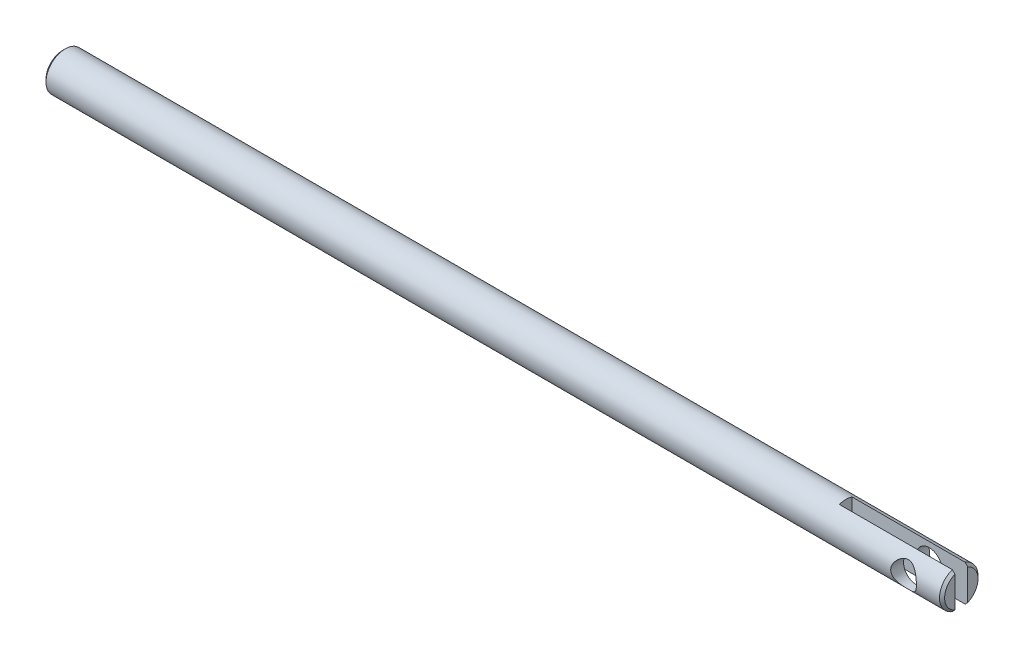
ISO-10303-21;
HEADER;
FILE_DESCRIPTION(('STEP AP214'),'2;1');
FILE_NAME('part.step','',(''),(''),'','','');
FILE_SCHEMA(('AUTOMOTIVE_DESIGN { 1 0 10303 214 1 1 1 1 }'));
ENDSEC;
DATA;
#1=APPLICATION_CONTEXT('core data for automotive mechanical design processes');
#2=APPLICATION_PROTOCOL_DEFINITION('international standard','automotive_design',2000,#1);
#3=PRODUCT_CONTEXT('',#1,'mechanical');
#4=PRODUCT('Part','Part','',(#3));
#5=PRODUCT_RELATED_PRODUCT_CATEGORY('part','',(#4));
#6=PRODUCT_DEFINITION_FORMATION('','',#4);
#7=PRODUCT_DEFINITION_CONTEXT('part definition',#1,'design');
#8=PRODUCT_DEFINITION('design','',#6,#7);
#9=PRODUCT_DEFINITION_SHAPE('','',#8);
#10=(LENGTH_UNIT() NAMED_UNIT(*) SI_UNIT(.MILLI.,.METRE.));
#11=(NAMED_UNIT(*) PLANE_ANGLE_UNIT() SI_UNIT($,.RADIAN.));
#12=(NAMED_UNIT(*) SI_UNIT($,.STERADIAN.) SOLID_ANGLE_UNIT());
#13=UNCERTAINTY_MEASURE_WITH_UNIT(LENGTH_MEASURE(1.E-05),#10,'distance_accuracy_value','');
#14=(GEOMETRIC_REPRESENTATION_CONTEXT(3) GLOBAL_UNCERTAINTY_ASSIGNED_CONTEXT((#13)) GLOBAL_UNIT_ASSIGNED_CONTEXT((#10,
#11,#12)) REPRESENTATION_CONTEXT('',''));
#15=CARTESIAN_POINT('',(0.,0.,0.));
#16=DIRECTION('',(0.,0.,1.));
#17=DIRECTION('',(1.,0.,0.));
#18=AXIS2_PLACEMENT_3D('',#15,#16,#17);
#19=CARTESIAN_POINT('',(0.,1.49999999999999,0.));
#20=DIRECTION('',(1.,0.,0.));
#21=DIRECTION('',(0.,1.,0.));
#22=AXIS2_PLACEMENT_3D('',#19,#20,#21);
#23=PLANE('',#22);
#24=DIRECTION('',(0.,1.,0.));
#25=VECTOR('',#24,1.);
#26=CARTESIAN_POINT('',(0.,-1.5,0.5));
#27=LINE('',#26,#25);
#28=CARTESIAN_POINT('',(0.,-1.20000000000001,0.5));
#29=VERTEX_POINT('',#28);
#30=CARTESIAN_POINT('',(0.,1.20000000000001,0.5));
#31=VERTEX_POINT('',#30);
#32=EDGE_CURVE('E121',#29,#31,#27,.T.);
#33=ORIENTED_EDGE('',*,*,#32,.T.);
#34=CARTESIAN_POINT('',(0.,0.,0.));
#35=DIRECTION('',(1.,0.,0.));
#36=DIRECTION('',(0.,1.,0.));
#37=AXIS2_PLACEMENT_3D('',#34,#35,#36);
#38=CIRCLE('',#37,1.30000000000001);
#39=EDGE_CURVE('E173',#31,#29,#38,.T.);
#40=ORIENTED_EDGE('',*,*,#39,.T.);
#41=EDGE_LOOP('',(#33,#40));
#42=FACE_BOUND('',#41,.T.);
#43=ADVANCED_FACE('F40',(#42),#23,.T.);
#44=CARTESIAN_POINT('',(-3.,0.,-1.5));
#45=DIRECTION('',(0.,0.,1.));
#46=DIRECTION('',(1.,0.,0.));
#47=AXIS2_PLACEMENT_3D('',#44,#45,#46);
#48=CYLINDRICAL_SURFACE('',#47,1.);
#49=CARTESIAN_POINT('',(-3.,0.,0.5));
#50=DIRECTION('',(0.,0.,1.));
#51=DIRECTION('',(1.,0.,0.));
#52=AXIS2_PLACEMENT_3D('',#49,#50,#51);
#53=CIRCLE('',#52,1.);
#54=CARTESIAN_POINT('',(-2.,0.,0.5));
#55=VERTEX_POINT('',#54);
#56=EDGE_CURVE('E127',#55,#55,#53,.F.);
#57=ORIENTED_EDGE('',*,*,#56,.T.);
#58=EDGE_LOOP('',(#57));
#59=FACE_BOUND('',#58,.T.);
#60=CARTESIAN_POINT('',(-2.,0.,1.5));
#61=CARTESIAN_POINT('',(-1.99999972518375,0.0502423583340636,1.50000020822414));
#62=CARTESIAN_POINT('',(-2.00380698497775,0.100484543566457,1.49745401376692));
#63=CARTESIAN_POINT('',(-2.01879843205283,0.199366529015833,1.48752326211905));
#64=CARTESIAN_POINT('',(-2.02998612156165,0.248005556977501,1.48013640790617));
#65=CARTESIAN_POINT('',(-2.05905385866242,0.342106153927126,1.46125241202353));
#66=CARTESIAN_POINT('',(-2.07690257000397,0.387581436328777,1.44977452746657));
#67=CARTESIAN_POINT('',(-2.11853168163575,0.474707645498629,1.4236306893872));
#68=CARTESIAN_POINT('',(-2.14231294315028,0.516358015804833,1.40896427302754));
#69=CARTESIAN_POINT('',(-2.19732846868371,0.598642350385054,1.37613664684919));
#70=CARTESIAN_POINT('',(-2.22902393037145,0.638890152730337,1.35778448789659));
#71=CARTESIAN_POINT('',(-2.29786502432922,0.713864022346368,1.31991156541732));
#72=CARTESIAN_POINT('',(-2.33501846491887,0.748582027719438,1.30038915178415));
#73=CARTESIAN_POINT('',(-2.42052618380633,0.81711148872748,1.25864132339397));
#74=CARTESIAN_POINT('',(-2.46972282660172,0.849915931813754,1.23647533968899));
#75=CARTESIAN_POINT('',(-2.57418168882327,0.906751785070867,1.19542073676408));
#76=CARTESIAN_POINT('',(-2.62943320078139,0.930798367132494,1.17652647977326));
#77=CARTESIAN_POINT('',(-2.7283556467108,0.963370175057203,1.14988133320735));
#78=CARTESIAN_POINT('',(-2.77076422643691,0.974372236180082,1.14048813946217));
#79=CARTESIAN_POINT('',(-2.85737225237086,0.9907530889261,1.12628984829785));
#80=CARTESIAN_POINT('',(-2.90156847436319,0.996141573259661,1.12147684372013));
#81=CARTESIAN_POINT('',(-2.99073738942807,1.00095682070629,1.11718302804083));
#82=CARTESIAN_POINT('',(-3.0357125117256,1.0003592145882,1.11772401279478));
#83=CARTESIAN_POINT('',(-3.12481748675048,0.993187906666195,1.12409887741485));
#84=CARTESIAN_POINT('',(-3.16894659101631,0.986609141899785,1.12993724142591));
#85=CARTESIAN_POINT('',(-3.25323352561879,0.968324971088713,1.1456359299579));
#86=CARTESIAN_POINT('',(-3.29348066796152,0.956858557405004,1.15530744165152));
#87=CARTESIAN_POINT('',(-3.37151184549575,0.929350592909502,1.17754811463844));
#88=CARTESIAN_POINT('',(-3.40929506514863,0.913307536614356,1.19011822916388));
#89=CARTESIAN_POINT('',(-3.48951269764114,0.87336909369832,1.21982098202211));
#90=CARTESIAN_POINT('',(-3.53132995009406,0.848540261643844,1.23736158924506));
#91=CARTESIAN_POINT('',(-3.6106916974919,0.793344802336531,1.27345768922483));
#92=CARTESIAN_POINT('',(-3.64823082883713,0.76297134504034,1.29201441370946));
#93=CARTESIAN_POINT('',(-3.72627127285556,0.689905826559713,1.33271671862095));
#94=CARTESIAN_POINT('',(-3.7656670243557,0.645969691404502,1.35477372355024));
#95=CARTESIAN_POINT('',(-3.83659824725493,0.551003999553813,1.39609050337856));
#96=CARTESIAN_POINT('',(-3.86814107270104,0.499981149675167,1.41535288825284));
#97=CARTESIAN_POINT('',(-3.9167388593142,0.402428913545604,1.44572702044165));
#98=CARTESIAN_POINT('',(-3.93542168167021,0.356978821685245,1.45769630582497));
#99=CARTESIAN_POINT('',(-3.96605246281194,0.263018021968458,1.47753859515521));
#100=CARTESIAN_POINT('',(-3.97800611356591,0.214509939501022,1.48541506063844));
#101=CARTESIAN_POINT('',(-3.9945805826192,0.115492726585951,1.49637941078331));
#102=CARTESIAN_POINT('',(-3.99916973046918,0.0649759059670271,1.49944661230575));
#103=CARTESIAN_POINT('',(-4.00062354428105,-0.0362207596946135,1.50041557482591));
#104=CARTESIAN_POINT('',(-3.99748875024439,-0.0869005930932786,1.49831769692815));
#105=CARTESIAN_POINT('',(-3.98418797221902,-0.183227858602144,1.48949794712138));
#106=CARTESIAN_POINT('',(-3.97453135112234,-0.228978722339653,1.48311123195135));
#107=CARTESIAN_POINT('',(-3.94920215699362,-0.318058196213637,1.46659224642396));
#108=CARTESIAN_POINT('',(-3.9335286245361,-0.361386418785352,1.45645937873408));
#109=CARTESIAN_POINT('',(-3.89567385147733,-0.447332375233218,1.4324817626467));
#110=CARTESIAN_POINT('',(-3.87315592295824,-0.489748092316561,1.41844935068245));
#111=CARTESIAN_POINT('',(-3.8227833550277,-0.570341511977787,1.38800927805402));
#112=CARTESIAN_POINT('',(-3.79492541973704,-0.608516574097252,1.37160015200651));
#113=CARTESIAN_POINT('',(-3.72969606591763,-0.68592722741532,1.33477273328242));
#114=CARTESIAN_POINT('',(-3.69151686994798,-0.724375937862662,1.31413078406202));
#115=CARTESIAN_POINT('',(-3.60944428503593,-0.79466984033239,1.27285586536854));
#116=CARTESIAN_POINT('',(-3.56554698050061,-0.826510468230431,1.25222291185946));
#117=CARTESIAN_POINT('',(-3.4764287935708,-0.880623882794762,1.21469839506517));
#118=CARTESIAN_POINT('',(-3.43163398310015,-0.903478180804392,1.19763798588661));
#119=CARTESIAN_POINT('',(-3.33806367360943,-0.94248106887625,1.16719487207112));
#120=CARTESIAN_POINT('',(-3.28929553080231,-0.958641728453858,1.1538055628277));
#121=CARTESIAN_POINT('',(-3.19771775643296,-0.981179217293118,1.13466604076532));
#122=CARTESIAN_POINT('',(-3.15541409507053,-0.988792987823091,1.12797499006894));
#123=CARTESIAN_POINT('',(-3.06971335933229,-0.998496029624887,1.11939733222928));
#124=CARTESIAN_POINT('',(-3.02631752442677,-1.00059130142516,1.11750550674065));
#125=CARTESIAN_POINT('',(-2.93967847164164,-0.999119609907757,1.11882100574832));
#126=CARTESIAN_POINT('',(-2.89643535931855,-0.995549293852657,1.12203134956833));
#127=CARTESIAN_POINT('',(-2.81132823572852,-0.982984986109972,1.13305226198639));
#128=CARTESIAN_POINT('',(-2.76946614306962,-0.973983758587651,1.14086896751216));
#129=CARTESIAN_POINT('',(-2.67714440678569,-0.94796517835631,1.16263421968269));
#130=CARTESIAN_POINT('',(-2.62736614363047,-0.929450935941996,1.17766166854602));
#131=CARTESIAN_POINT('',(-2.53225658291059,-0.885422631474877,1.2111108062916));
#132=CARTESIAN_POINT('',(-2.48693165103158,-0.859898741785424,1.22953724861882));
#133=CARTESIAN_POINT('',(-2.40035905640317,-0.801991402694661,1.26808593269725));
#134=CARTESIAN_POINT('',(-2.35920062728075,-0.769491549448276,1.2882329369107));
#135=CARTESIAN_POINT('',(-2.28233876087877,-0.698358840177314,1.32814150773992));
#136=CARTESIAN_POINT('',(-2.2466370014876,-0.659724105134957,1.34790295417639));
#137=CARTESIAN_POINT('',(-2.17664394784295,-0.570728664877774,1.38815775980392));
#138=CARTESIAN_POINT('',(-2.14329067991018,-0.519480834775993,1.40834902724557));
#139=CARTESIAN_POINT('',(-2.08604336166802,-0.410434277887496,1.44388832937517));
#140=CARTESIAN_POINT('',(-2.06213444658818,-0.352646031225029,1.4592439672273));
#141=CARTESIAN_POINT('',(-2.02942271091799,-0.24571753491753,1.48050822418367));
#142=CARTESIAN_POINT('',(-2.01844448045066,-0.197506162628871,1.48775740184445));
#143=CARTESIAN_POINT('',(-2.00373598373098,-0.0995290060120671,1.49750140070948));
#144=CARTESIAN_POINT('',(-2.000000272202,-0.0497644180940297,1.49999979375663));
#145=CARTESIAN_POINT('',(-2.,0.,1.5));
#146=B_SPLINE_CURVE_WITH_KNOTS('',3,(#60,#61,#62,#63,#64,#65,#66,#67,#68,#69,#70,#71,#72,#73,
#74,#75,#76,#77,#78,#79,#80,#81,#82,#83,#84,#85,#86,#87,#88,#89,#90,#91,#92,#93,#94,#95,#96,#97,
#98,#99,#100,#101,#102,#103,#104,#105,#106,#107,#108,#109,#110,#111,#112,#113,#114,#115,#116,
#117,#118,#119,#120,#121,#122,#123,#124,#125,#126,#127,#128,#129,#130,#131,#132,#133,#134,#135,
#136,#137,#138,#139,#140,#141,#142,#143,#144,#145),.UNSPECIFIED.,.T.,.F.,(4,2,2,2,2,2,2,2,2,2,2,
2,2,2,2,2,2,2,2,2,2,2,2,2,2,2,2,2,2,2,2,2,2,2,2,2,2,2,2,2,2,2,4),(0.,0.150526613252699,
0.301124707174344,0.451023076595116,0.600943219336932,0.763585145002783,0.926462058021592,
1.11503341647991,1.30327652722719,1.43716846838015,1.57082883922904,1.70503355867689,
1.83935198631676,1.96774431099011,2.09617891902539,2.25073787329797,2.40548851889212,
2.5935947724756,2.78152420149865,2.93262043847563,3.0835886757059,3.23520441646309,
3.38680955765891,3.5277654239542,3.66874377568319,3.81826173413942,3.96787227471786,
4.14114088069829,4.31452876587063,4.473249676497,4.63168313315306,4.76162024003012,
4.8914160016149,5.02128860137217,5.15133461921144,5.31603304346011,5.48096356682587,
5.64889622595852,5.81688041978686,6.00897675773024,6.20076953274023,6.34997645676983,
6.49907115623394),.UNSPECIFIED.);
#147=CARTESIAN_POINT('',(-2.,0.,1.5));
#148=VERTEX_POINT('',#147);
#149=EDGE_CURVE('E130',#148,#148,#146,.T.);
#150=ORIENTED_EDGE('',*,*,#149,.T.);
#151=EDGE_LOOP('',(#150));
#152=FACE_BOUND('',#151,.T.);
#153=ADVANCED_FACE('F153',(#59,#152),#48,.F.);
#154=CARTESIAN_POINT('',(0.,0.,0.));
#155=DIRECTION('',(-1.,0.,0.));
#156=DIRECTION('',(0.,-1.,0.));
#157=AXIS2_PLACEMENT_3D('',#154,#155,#156);
#158=CONICAL_SURFACE('',#157,1.30000000000001,0.785398163397436);
#159=CARTESIAN_POINT('',(-0.200699999999992,1.41495600284955,0.5));
#160=CARTESIAN_POINT('',(-0.158123110444248,1.36978572423713,0.5));
#161=CARTESIAN_POINT('',(-0.115652741441511,1.32451353423616,0.5));
#162=CARTESIAN_POINT('',(-0.0309990029629957,1.23362950858963,0.5));
#163=CARTESIAN_POINT('',(0.0111840899659806,1.18801741555807,0.5));
#164=CARTESIAN_POINT('',(0.0964180633701382,1.09497344390221,0.5));
#165=CARTESIAN_POINT('',(0.139455265209751,1.04752900944401,0.5));
#166=CARTESIAN_POINT('',(0.224829182826531,0.952076958611879,0.5));
#167=CARTESIAN_POINT('',(0.267166413387566,0.904069804947357,0.5));
#168=CARTESIAN_POINT('',(0.350788446158843,0.807217119690665,0.5));
#169=CARTESIAN_POINT('',(0.39207411636959,0.758372339183208,0.5));
#170=CARTESIAN_POINT('',(0.473121637652178,0.659212174030844,0.5));
#171=CARTESIAN_POINT('',(0.51287957162681,0.608893525411639,0.5));
#172=CARTESIAN_POINT('',(0.570041865454716,0.53208994223167,0.5));
#173=CARTESIAN_POINT('',(0.588567685501148,0.506443658555305,0.5));
#174=CARTESIAN_POINT('',(0.624597632105828,0.454446780401328,0.5));
#175=CARTESIAN_POINT('',(0.642102045195436,0.428096386498572,0.5));
#176=CARTESIAN_POINT('',(0.675596596373045,0.374584607448489,0.5));
#177=CARTESIAN_POINT('',(0.691592383711208,0.34742679320373,0.5));
#178=CARTESIAN_POINT('',(0.721461599560177,0.291979843702112,0.5));
#179=CARTESIAN_POINT('',(0.735337797967258,0.263692246942248,0.5));
#180=CARTESIAN_POINT('',(0.754017116892704,0.21972776982632,0.5));
#181=CARTESIAN_POINT('',(0.759970281671413,0.204542386023077,0.5));
#182=CARTESIAN_POINT('',(0.770848947591589,0.173806026937903,0.5));
#183=CARTESIAN_POINT('',(0.775774230535324,0.158254974810241,0.5));
#184=CARTESIAN_POINT('',(0.788647810542469,0.111260819823713,0.5));
#185=CARTESIAN_POINT('',(0.794784151859932,0.0792763405576124,0.5));
#186=CARTESIAN_POINT('',(0.800843689051247,0.0143366110026087,0.5));
#187=CARTESIAN_POINT('',(0.800698239741102,-0.0186254288947944,0.5));
#188=CARTESIAN_POINT('',(0.794049633860656,-0.0839997461898909,0.5));
#189=CARTESIAN_POINT('',(0.787519576103568,-0.116409106912415,0.5));
#190=CARTESIAN_POINT('',(0.772100004311058,-0.170752308813592,0.5));
#191=CARTESIAN_POINT('',(0.76440470224953,-0.193050532954734,0.5));
#192=CARTESIAN_POINT('',(0.747086097461046,-0.236893973733534,0.5));
#193=CARTESIAN_POINT('',(0.737461546751829,-0.258438692297225,0.5));
#194=CARTESIAN_POINT('',(0.716667534286072,-0.301043410258873,0.5));
#195=CARTESIAN_POINT('',(0.705482581289545,-0.322095712222197,0.5));
#196=CARTESIAN_POINT('',(0.68202578452451,-0.363568907889214,0.5));
#197=CARTESIAN_POINT('',(0.669754350644946,-0.383990035821956,0.5));
#198=CARTESIAN_POINT('',(0.625939416567962,-0.45372064664585,0.5));
#199=CARTESIAN_POINT('',(0.592376475234068,-0.501751741103939,0.5));
#200=CARTESIAN_POINT('',(0.522714416232876,-0.595952689699732,0.5));
#201=CARTESIAN_POINT('',(0.486612469325218,-0.642120374326524,0.5));
#202=CARTESIAN_POINT('',(0.412766609998626,-0.733420070379991,0.5));
#203=CARTESIAN_POINT('',(0.375016813769713,-0.778547310415562,0.5));
#204=CARTESIAN_POINT('',(0.298589013270444,-0.867962487114289,0.5));
#205=CARTESIAN_POINT('',(0.25991148253913,-0.912250832145326,0.5));
#206=CARTESIAN_POINT('',(0.186347368146678,-0.995262395554173,0.5));
#207=CARTESIAN_POINT('',(0.151529169252361,-1.03404635906982,0.5));
#208=CARTESIAN_POINT('',(0.0815205080203143,-1.11128667576953,0.5));
#209=CARTESIAN_POINT('',(0.0463299912223991,-1.14974297949795,0.5));
#210=CARTESIAN_POINT('',(-0.0240529289648294,-1.22610540518904,0.5));
#211=CARTESIAN_POINT('',(-0.059243214457122,-1.26401348213408,0.5));
#212=CARTESIAN_POINT('',(-0.12982993305977,-1.33962417017204,0.5));
#213=CARTESIAN_POINT('',(-0.165226326752405,-1.37732681804515,0.5));
#214=CARTESIAN_POINT('',(-0.200699999999992,-1.41495600284955,0.5));
#215=B_SPLINE_CURVE_WITH_KNOTS('',3,(#159,#160,#161,#162,#163,#164,#165,#166,#167,#168,#169,
#170,#171,#172,#173,#174,#175,#176,#177,#178,#179,#180,#181,#182,#183,#184,#185,#186,#187,#188,
#189,#190,#191,#192,#193,#194,#195,#196,#197,#198,#199,#200,#201,#202,#203,#204,#205,#206,#207,
#208,#209,#210,#211,#212,#213,#214),.UNSPECIFIED.,.F.,.F.,(4,2,2,2,2,2,2,2,2,2,2,2,2,2,2,2,2,2,
2,2,2,2,2,2,2,2,2,4),(0.,0.18622264320256,0.372604566470571,0.564768816519382,0.756784819383444,
0.948636820223556,1.14095173020882,1.23584803017517,1.33071757998479,1.42521646231084,
1.51959077630242,1.56848971671423,1.61739902680959,1.71456439320266,1.81279181420175,
1.91143490234827,1.98210501649497,2.05282099374399,2.12429693960838,2.19574603422311,
2.37133786476196,2.54712855783251,2.72360861718805,2.90000043695765,3.05635752258121,
3.21273780428534,3.36790910078899,3.52305163678165),.UNSPECIFIED.);
#216=CARTESIAN_POINT('',(-0.199999999999992,1.41421356237309,0.5));
#217=VERTEX_POINT('',#216);
#218=EDGE_CURVE('E178',#217,#31,#215,.T.);
#219=ORIENTED_EDGE('',*,*,#218,.F.);
#220=CARTESIAN_POINT('',(-0.199999999999992,0.,0.));
#221=DIRECTION('',(1.,0.,0.));
#222=DIRECTION('',(0.,1.,0.));
#223=AXIS2_PLACEMENT_3D('',#220,#221,#222);
#224=CIRCLE('',#223,1.5);
#225=CARTESIAN_POINT('',(-0.199999999999992,-1.41421356237309,0.5));
#226=VERTEX_POINT('',#225);
#227=EDGE_CURVE('E319',#226,#217,#224,.F.);
#228=ORIENTED_EDGE('',*,*,#227,.F.);
#229=EDGE_CURVE('E180',#29,#226,#215,.T.);
#230=ORIENTED_EDGE('',*,*,#229,.F.);
#231=ORIENTED_EDGE('',*,*,#39,.F.);
#232=EDGE_LOOP('',(#219,#228,#230,#231));
#233=FACE_BOUND('',#232,.T.);
#234=ADVANCED_FACE('F168',(#233),#158,.T.);
#235=CARTESIAN_POINT('',(-70.,0.,0.));
#236=DIRECTION('',(-1.,0.,0.));
#237=DIRECTION('',(0.,-1.,0.));
#238=AXIS2_PLACEMENT_3D('',#235,#236,#237);
#239=PLANE('',#238);
#240=CARTESIAN_POINT('',(-70.,0.,0.));
#241=DIRECTION('',(-1.,0.,0.));
#242=DIRECTION('',(0.,-1.,0.));
#243=AXIS2_PLACEMENT_3D('',#240,#241,#242);
#244=CIRCLE('',#243,1.29999999999997);
#245=CARTESIAN_POINT('',(-70.,-1.29999999999998,0.));
#246=VERTEX_POINT('',#245);
#247=EDGE_CURVE('E187',#246,#246,#244,.T.);
#248=ORIENTED_EDGE('',*,*,#247,.T.);
#249=EDGE_LOOP('',(#248));
#250=FACE_BOUND('',#249,.T.);
#251=ADVANCED_FACE('F162',(#250),#239,.T.);
#252=CARTESIAN_POINT('',(0.,0.,0.));
#253=DIRECTION('',(1.,0.,0.));
#254=DIRECTION('',(0.,1.,0.));
#255=AXIS2_PLACEMENT_3D('',#252,#253,#254);
#256=CYLINDRICAL_SURFACE('',#255,1.5);
#257=DIRECTION('',(1.,0.,0.));
#258=VECTOR('',#257,1.);
#259=CARTESIAN_POINT('',(0.,-1.41421356237309,0.5));
#260=LINE('',#259,#258);
#261=CARTESIAN_POINT('',(-9.,-1.41421356237309,0.499999999999999));
#262=VERTEX_POINT('',#261);
#263=EDGE_CURVE('E119',#226,#262,#260,.F.);
#264=ORIENTED_EDGE('',*,*,#263,.F.);
#265=ORIENTED_EDGE('',*,*,#227,.T.);
#266=DIRECTION('',(1.,0.,0.));
#267=VECTOR('',#266,1.);
#268=CARTESIAN_POINT('',(0.,1.41421356237309,0.5));
#269=LINE('',#268,#267);
#270=CARTESIAN_POINT('',(-9.,1.41421356237309,0.499999999999999));
#271=VERTEX_POINT('',#270);
#272=EDGE_CURVE('E65',#271,#217,#269,.T.);
#273=ORIENTED_EDGE('',*,*,#272,.F.);
#274=CARTESIAN_POINT('',(-9.,0.,0.));
#275=DIRECTION('',(-1.,0.,0.));
#276=DIRECTION('',(0.,0.,1.));
#277=AXIS2_PLACEMENT_3D('',#274,#275,#276);
#278=CIRCLE('',#277,1.5);
#279=CARTESIAN_POINT('',(-9.,1.41421356237309,-0.499999999999999));
#280=VERTEX_POINT('',#279);
#281=EDGE_CURVE('E46',#280,#271,#278,.F.);
#282=ORIENTED_EDGE('',*,*,#281,.F.);
#283=DIRECTION('',(1.,0.,0.));
#284=VECTOR('',#283,1.);
#285=CARTESIAN_POINT('',(0.,1.41421356237309,-0.5));
#286=LINE('',#285,#284);
#287=CARTESIAN_POINT('',(-0.199999999999992,1.41421356237309,-0.5));
#288=VERTEX_POINT('',#287);
#289=EDGE_CURVE('E109',#288,#280,#286,.F.);
#290=ORIENTED_EDGE('',*,*,#289,.F.);
#291=CARTESIAN_POINT('',(-0.199999999999992,-1.41421356237309,-0.5));
#292=VERTEX_POINT('',#291);
#293=EDGE_CURVE('E115',#288,#292,#224,.F.);
#294=ORIENTED_EDGE('',*,*,#293,.T.);
#295=DIRECTION('',(1.,0.,0.));
#296=VECTOR('',#295,1.);
#297=CARTESIAN_POINT('',(0.,-1.41421356237309,-0.5));
#298=LINE('',#297,#296);
#299=CARTESIAN_POINT('',(-9.,-1.41421356237309,-0.499999999999999));
#300=VERTEX_POINT('',#299);
#301=EDGE_CURVE('E106',#300,#292,#298,.T.);
#302=ORIENTED_EDGE('',*,*,#301,.F.);
#303=EDGE_CURVE('E12',#262,#300,#278,.F.);
#304=ORIENTED_EDGE('',*,*,#303,.F.);
#305=EDGE_LOOP('',(#264,#265,#273,#282,#290,#294,#302,#304));
#306=FACE_BOUND('',#305,.T.);
#307=CARTESIAN_POINT('',(-69.8,0.,0.));
#308=DIRECTION('',(-1.,0.,0.));
#309=DIRECTION('',(0.,-1.,0.));
#310=AXIS2_PLACEMENT_3D('',#307,#308,#309);
#311=CIRCLE('',#310,1.5);
#312=CARTESIAN_POINT('',(-69.8,-1.5,0.));
#313=VERTEX_POINT('',#312);
#314=EDGE_CURVE('E316',#313,#313,#311,.F.);
#315=ORIENTED_EDGE('',*,*,#314,.T.);
#316=EDGE_LOOP('',(#315));
#317=FACE_BOUND('',#316,.T.);
#318=CARTESIAN_POINT('',(-2.,0.,-1.5));
#319=CARTESIAN_POINT('',(-1.99999972518375,-0.050242358334064,-1.50000020822414));
#320=CARTESIAN_POINT('',(-2.00380698497775,-0.100484543566457,-1.49745401376692));
#321=CARTESIAN_POINT('',(-2.01879843205283,-0.199366529015834,-1.48752326211905));
#322=CARTESIAN_POINT('',(-2.02998612156165,-0.248005556977501,-1.48013640790617));
#323=CARTESIAN_POINT('',(-2.05905385866242,-0.342106153927126,-1.46125241202353));
#324=CARTESIAN_POINT('',(-2.07690257000397,-0.387581436328778,-1.44977452746657));
#325=CARTESIAN_POINT('',(-2.11853168163575,-0.474707645498629,-1.4236306893872));
#326=CARTESIAN_POINT('',(-2.14231294315028,-0.516358015804834,-1.40896427302754));
#327=CARTESIAN_POINT('',(-2.19732846868371,-0.598642350385054,-1.37613664684919));
#328=CARTESIAN_POINT('',(-2.22902393037145,-0.638890152730338,-1.35778448789659));
#329=CARTESIAN_POINT('',(-2.29786502432922,-0.713864022346369,-1.31991156541732));
#330=CARTESIAN_POINT('',(-2.33501846491887,-0.748582027719439,-1.30038915178415));
#331=CARTESIAN_POINT('',(-2.42052618380634,-0.81711148872748,-1.25864132339397));
#332=CARTESIAN_POINT('',(-2.46972282660172,-0.849915931813755,-1.23647533968899));
#333=CARTESIAN_POINT('',(-2.57418168882327,-0.906751785070868,-1.19542073676408));
#334=CARTESIAN_POINT('',(-2.62943320078139,-0.930798367132494,-1.17652647977326));
#335=CARTESIAN_POINT('',(-2.7283556467108,-0.963370175057203,-1.14988133320735));
#336=CARTESIAN_POINT('',(-2.77076422643691,-0.974372236180082,-1.14048813946217));
#337=CARTESIAN_POINT('',(-2.85737225237087,-0.9907530889261,-1.12628984829785));
#338=CARTESIAN_POINT('',(-2.90156847436319,-0.996141573259661,-1.12147684372013));
#339=CARTESIAN_POINT('',(-2.99073738942807,-1.00095682070629,-1.11718302804083));
#340=CARTESIAN_POINT('',(-3.0357125117256,-1.0003592145882,-1.11772401279478));
#341=CARTESIAN_POINT('',(-3.12481748675048,-0.993187906666195,-1.12409887741485));
#342=CARTESIAN_POINT('',(-3.16894659101631,-0.986609141899784,-1.12993724142591));
#343=CARTESIAN_POINT('',(-3.25323352561879,-0.968324971088713,-1.1456359299579));
#344=CARTESIAN_POINT('',(-3.29348066796152,-0.956858557405004,-1.15530744165152));
#345=CARTESIAN_POINT('',(-3.37151184549575,-0.929350592909502,-1.17754811463844));
#346=CARTESIAN_POINT('',(-3.40929506514863,-0.913307536614356,-1.19011822916388));
#347=CARTESIAN_POINT('',(-3.48951269764114,-0.87336909369832,-1.21982098202211));
#348=CARTESIAN_POINT('',(-3.53132995009406,-0.848540261643844,-1.23736158924506));
#349=CARTESIAN_POINT('',(-3.6106916974919,-0.793344802336531,-1.27345768922483));
#350=CARTESIAN_POINT('',(-3.64823082883713,-0.76297134504034,-1.29201441370946));
#351=CARTESIAN_POINT('',(-3.72627127285556,-0.689905826559713,-1.33271671862095));
#352=CARTESIAN_POINT('',(-3.7656670243557,-0.645969691404501,-1.35477372355024));
#353=CARTESIAN_POINT('',(-3.83659824725493,-0.551003999553812,-1.39609050337856));
#354=CARTESIAN_POINT('',(-3.86814107270104,-0.499981149675166,-1.41535288825284));
#355=CARTESIAN_POINT('',(-3.9167388593142,-0.402428913545603,-1.44572702044165));
#356=CARTESIAN_POINT('',(-3.93542168167021,-0.356978821685244,-1.45769630582497));
#357=CARTESIAN_POINT('',(-3.96605246281194,-0.263018021968457,-1.47753859515521));
#358=CARTESIAN_POINT('',(-3.97800611356591,-0.214509939501021,-1.48541506063844));
#359=CARTESIAN_POINT('',(-3.9945805826192,-0.11549272658595,-1.49637941078331));
#360=CARTESIAN_POINT('',(-3.99916973046918,-0.0649759059670257,-1.49944661230575));
#361=CARTESIAN_POINT('',(-4.00062354428105,0.036220759694615,-1.50041557482591));
#362=CARTESIAN_POINT('',(-3.99748875024439,0.0869005930932802,-1.49831769692815));
#363=CARTESIAN_POINT('',(-3.98418797221902,0.183227858602145,-1.48949794712138));
#364=CARTESIAN_POINT('',(-3.97453135112234,0.228978722339654,-1.48311123195135));
#365=CARTESIAN_POINT('',(-3.94920215699362,0.318058196213639,-1.46659224642396));
#366=CARTESIAN_POINT('',(-3.9335286245361,0.361386418785354,-1.45645937873408));
#367=CARTESIAN_POINT('',(-3.89567385147732,0.44733237523322,-1.4324817626467));
#368=CARTESIAN_POINT('',(-3.87315592295824,0.489748092316562,-1.41844935068245));
#369=CARTESIAN_POINT('',(-3.8227833550277,0.570341511977789,-1.38800927805402));
#370=CARTESIAN_POINT('',(-3.79492541973704,0.608516574097253,-1.37160015200651));
#371=CARTESIAN_POINT('',(-3.72969606591763,0.685927227415322,-1.33477273328242));
#372=CARTESIAN_POINT('',(-3.69151686994798,0.724375937862664,-1.31413078406202));
#373=CARTESIAN_POINT('',(-3.60944428503593,0.794669840332391,-1.27285586536854));
#374=CARTESIAN_POINT('',(-3.5655469805006,0.826510468230432,-1.25222291185946));
#375=CARTESIAN_POINT('',(-3.4764287935708,0.880623882794763,-1.21469839506517));
#376=CARTESIAN_POINT('',(-3.43163398310015,0.903478180804393,-1.19763798588661));
#377=CARTESIAN_POINT('',(-3.33806367360943,0.94248106887625,-1.16719487207112));
#378=CARTESIAN_POINT('',(-3.28929553080231,0.958641728453858,-1.15380556282769));
#379=CARTESIAN_POINT('',(-3.19771775643296,0.981179217293119,-1.13466604076532));
#380=CARTESIAN_POINT('',(-3.15541409507053,0.988792987823092,-1.12797499006894));
#381=CARTESIAN_POINT('',(-3.06971335933229,0.998496029624887,-1.11939733222928));
#382=CARTESIAN_POINT('',(-3.02631752442677,1.00059130142516,-1.11750550674065));
#383=CARTESIAN_POINT('',(-2.93967847164164,0.999119609907757,-1.11882100574832));
#384=CARTESIAN_POINT('',(-2.89643535931854,0.995549293852657,-1.12203134956833));
#385=CARTESIAN_POINT('',(-2.81132823572852,0.982984986109972,-1.13305226198639));
#386=CARTESIAN_POINT('',(-2.76946614306962,0.973983758587651,-1.14086896751216));
#387=CARTESIAN_POINT('',(-2.67714440678569,0.94796517835631,-1.16263421968269));
#388=CARTESIAN_POINT('',(-2.62736614363047,0.929450935941995,-1.17766166854602));
#389=CARTESIAN_POINT('',(-2.53225658291059,0.885422631474876,-1.2111108062916));
#390=CARTESIAN_POINT('',(-2.48693165103158,0.859898741785423,-1.22953724861882));
#391=CARTESIAN_POINT('',(-2.40035905640317,0.80199140269466,-1.26808593269725));
#392=CARTESIAN_POINT('',(-2.35920062728075,0.769491549448275,-1.2882329369107));
#393=CARTESIAN_POINT('',(-2.28233876087877,0.698358840177312,-1.32814150773992));
#394=CARTESIAN_POINT('',(-2.2466370014876,0.659724105134955,-1.34790295417639));
#395=CARTESIAN_POINT('',(-2.17664394784295,0.570728664877773,-1.38815775980392));
#396=CARTESIAN_POINT('',(-2.14329067991018,0.519480834775991,-1.40834902724557));
#397=CARTESIAN_POINT('',(-2.08604336166802,0.410434277887494,-1.44388832937517));
#398=CARTESIAN_POINT('',(-2.06213444658818,0.352646031225027,-1.4592439672273));
#399=CARTESIAN_POINT('',(-2.02942271091799,0.245717534917529,-1.48050822418367));
#400=CARTESIAN_POINT('',(-2.01844448045066,0.19750616262887,-1.48775740184445));
#401=CARTESIAN_POINT('',(-2.00373598373098,0.0995290060120667,-1.49750140070948));
#402=CARTESIAN_POINT('',(-2.000000272202,0.0497644180940294,-1.49999979375663));
#403=CARTESIAN_POINT('',(-2.,0.,-1.5));
#404=B_SPLINE_CURVE_WITH_KNOTS('',3,(#318,#319,#320,#321,#322,#323,#324,#325,#326,#327,#328,
#329,#330,#331,#332,#333,#334,#335,#336,#337,#338,#339,#340,#341,#342,#343,#344,#345,#346,#347,
#348,#349,#350,#351,#352,#353,#354,#355,#356,#357,#358,#359,#360,#361,#362,#363,#364,#365,#366,
#367,#368,#369,#370,#371,#372,#373,#374,#375,#376,#377,#378,#379,#380,#381,#382,#383,#384,#385,
#386,#387,#388,#389,#390,#391,#392,#393,#394,#395,#396,#397,#398,#399,#400,#401,#402,#403),
.UNSPECIFIED.,.T.,.F.,(4,2,2,2,2,2,2,2,2,2,2,2,2,2,2,2,2,2,2,2,2,2,2,2,2,2,2,2,2,2,2,2,2,2,2,2,
2,2,2,2,2,2,4),(0.,0.1505266132527,0.301124707174344,0.451023076595116,0.600943219336932,
0.763585145002783,0.926462058021593,1.11503341647991,1.30327652722719,1.43716846838014,
1.57082883922904,1.70503355867689,1.83935198631676,1.96774431099011,2.09617891902539,
2.25073787329796,2.40548851889212,2.5935947724756,2.78152420149865,2.93262043847563,
3.0835886757059,3.23520441646309,3.38680955765891,3.5277654239542,3.66874377568319,
3.81826173413942,3.96787227471786,4.14114088069829,4.31452876587063,4.473249676497,
4.63168313315306,4.76162024003012,4.8914160016149,5.02128860137217,5.15133461921144,
5.31603304346011,5.48096356682586,5.64889622595852,5.81688041978685,6.00897675773024,
6.20076953274023,6.34997645676982,6.49907115623394),.UNSPECIFIED.);
#405=CARTESIAN_POINT('',(-2.,0.,-1.5));
#406=VERTEX_POINT('',#405);
#407=EDGE_CURVE('E138',#406,#406,#404,.T.);
#408=ORIENTED_EDGE('',*,*,#407,.F.);
#409=EDGE_LOOP('',(#408));
#410=FACE_BOUND('',#409,.T.);
#411=ORIENTED_EDGE('',*,*,#149,.F.);
#412=EDGE_LOOP('',(#411));
#413=FACE_BOUND('',#412,.T.);
#414=ADVANCED_FACE('F112',(#306,#317,#410,#413),#256,.T.);
#415=DIRECTION('',(0.,1.,0.));
#416=VECTOR('',#415,1.);
#417=CARTESIAN_POINT('',(0.,-1.5,-0.5));
#418=LINE('',#417,#416);
#419=CARTESIAN_POINT('',(0.,-1.20000000000001,-0.5));
#420=VERTEX_POINT('',#419);
#421=CARTESIAN_POINT('',(0.,1.20000000000001,-0.5));
#422=VERTEX_POINT('',#421);
#423=EDGE_CURVE('E57',#420,#422,#418,.T.);
#424=ORIENTED_EDGE('',*,*,#423,.F.);
#425=EDGE_CURVE('E182',#420,#422,#38,.T.);
#426=ORIENTED_EDGE('',*,*,#425,.T.);
#427=EDGE_LOOP('',(#424,#426));
#428=FACE_BOUND('',#427,.T.);
#429=ADVANCED_FACE('F151',(#428),#23,.T.);
#430=CARTESIAN_POINT('',(-3.,0.,-0.5));
#431=DIRECTION('',(0.,0.,-1.));
#432=DIRECTION('',(-1.,0.,0.));
#433=AXIS2_PLACEMENT_3D('',#430,#431,#432);
#434=CIRCLE('',#433,1.);
#435=CARTESIAN_POINT('',(-4.,0.,-0.499999999999999));
#436=VERTEX_POINT('',#435);
#437=EDGE_CURVE('E116',#436,#436,#434,.F.);
#438=ORIENTED_EDGE('',*,*,#437,.T.);
#439=EDGE_LOOP('',(#438));
#440=FACE_BOUND('',#439,.T.);
#441=ORIENTED_EDGE('',*,*,#407,.T.);
#442=EDGE_LOOP('',(#441));
#443=FACE_BOUND('',#442,.T.);
#444=ADVANCED_FACE('F146',(#440,#443),#48,.F.);
#445=CARTESIAN_POINT('',(-69.8,0.,0.));
#446=DIRECTION('',(1.,0.,0.));
#447=DIRECTION('',(0.,1.,0.));
#448=AXIS2_PLACEMENT_3D('',#445,#446,#447);
#449=CONICAL_SURFACE('',#448,1.5,0.785398163397454);
#450=ORIENTED_EDGE('',*,*,#247,.F.);
#451=EDGE_LOOP('',(#450));
#452=FACE_BOUND('',#451,.T.);
#453=ORIENTED_EDGE('',*,*,#314,.F.);
#454=EDGE_LOOP('',(#453));
#455=FACE_BOUND('',#454,.T.);
#456=ADVANCED_FACE('F150',(#452,#455),#449,.T.);
#457=CARTESIAN_POINT('',(-0.200699999999992,-1.41495600284955,-0.5));
#458=CARTESIAN_POINT('',(-0.158123110444248,-1.36978572423713,-0.5));
#459=CARTESIAN_POINT('',(-0.115652741441511,-1.32451353423616,-0.5));
#460=CARTESIAN_POINT('',(-0.0309990029629956,-1.23362950858963,-0.5));
#461=CARTESIAN_POINT('',(0.0111840899659807,-1.18801741555807,-0.5));
#462=CARTESIAN_POINT('',(0.0964180633701382,-1.09497344390221,-0.5));
#463=CARTESIAN_POINT('',(0.139455265209751,-1.04752900944401,-0.5));
#464=CARTESIAN_POINT('',(0.224829182826531,-0.95207695861188,-0.5));
#465=CARTESIAN_POINT('',(0.267166413387566,-0.904069804947358,-0.5));
#466=CARTESIAN_POINT('',(0.350788446158843,-0.807217119690665,-0.5));
#467=CARTESIAN_POINT('',(0.39207411636959,-0.758372339183208,-0.5));
#468=CARTESIAN_POINT('',(0.473121637652178,-0.659212174030844,-0.5));
#469=CARTESIAN_POINT('',(0.51287957162681,-0.608893525411639,-0.5));
#470=CARTESIAN_POINT('',(0.570041865454716,-0.53208994223167,-0.5));
#471=CARTESIAN_POINT('',(0.588567685501148,-0.506443658555305,-0.5));
#472=CARTESIAN_POINT('',(0.624597632105828,-0.454446780401328,-0.5));
#473=CARTESIAN_POINT('',(0.642102045195436,-0.428096386498572,-0.5));
#474=CARTESIAN_POINT('',(0.675596596373045,-0.374584607448489,-0.5));
#475=CARTESIAN_POINT('',(0.691592383711208,-0.34742679320373,-0.5));
#476=CARTESIAN_POINT('',(0.721461599560176,-0.291979843702112,-0.5));
#477=CARTESIAN_POINT('',(0.735337797967259,-0.263692246942248,-0.5));
#478=CARTESIAN_POINT('',(0.754017116892704,-0.21972776982632,-0.5));
#479=CARTESIAN_POINT('',(0.759970281671413,-0.204542386023078,-0.5));
#480=CARTESIAN_POINT('',(0.770848947591589,-0.173806026937903,-0.5));
#481=CARTESIAN_POINT('',(0.775774230535324,-0.158254974810241,-0.5));
#482=CARTESIAN_POINT('',(0.788647810542469,-0.111260819823714,-0.5));
#483=CARTESIAN_POINT('',(0.794784151859932,-0.0792763405576126,-0.5));
#484=CARTESIAN_POINT('',(0.800843689051247,-0.0143366110026088,-0.5));
#485=CARTESIAN_POINT('',(0.800698239741101,0.0186254288947942,-0.5));
#486=CARTESIAN_POINT('',(0.794049633860656,0.0839997461898907,-0.5));
#487=CARTESIAN_POINT('',(0.787519576103569,0.116409106912415,-0.5));
#488=CARTESIAN_POINT('',(0.772100004311058,0.170752308813592,-0.5));
#489=CARTESIAN_POINT('',(0.76440470224953,0.193050532954734,-0.5));
#490=CARTESIAN_POINT('',(0.747086097461047,0.236893973733534,-0.5));
#491=CARTESIAN_POINT('',(0.737461546751829,0.258438692297225,-0.5));
#492=CARTESIAN_POINT('',(0.716667534286073,0.301043410258873,-0.5));
#493=CARTESIAN_POINT('',(0.705482581289546,0.322095712222197,-0.5));
#494=CARTESIAN_POINT('',(0.682025784524511,0.363568907889214,-0.5));
#495=CARTESIAN_POINT('',(0.669754350644946,0.383990035821956,-0.5));
#496=CARTESIAN_POINT('',(0.625939416567962,0.45372064664585,-0.5));
#497=CARTESIAN_POINT('',(0.592376475234068,0.501751741103939,-0.5));
#498=CARTESIAN_POINT('',(0.522714416232876,0.595952689699732,-0.5));
#499=CARTESIAN_POINT('',(0.486612469325218,0.642120374326523,-0.5));
#500=CARTESIAN_POINT('',(0.412766609998626,0.733420070379991,-0.5));
#501=CARTESIAN_POINT('',(0.375016813769712,0.778547310415562,-0.5));
#502=CARTESIAN_POINT('',(0.298589013270444,0.867962487114289,-0.5));
#503=CARTESIAN_POINT('',(0.25991148253913,0.912250832145326,-0.5));
#504=CARTESIAN_POINT('',(0.186347368146678,0.995262395554173,-0.5));
#505=CARTESIAN_POINT('',(0.151529169252361,1.03404635906983,-0.5));
#506=CARTESIAN_POINT('',(0.081520508020314,1.11128667576953,-0.5));
#507=CARTESIAN_POINT('',(0.0463299912223988,1.14974297949795,-0.5));
#508=CARTESIAN_POINT('',(-0.0240529289648295,1.22610540518904,-0.5));
#509=CARTESIAN_POINT('',(-0.059243214457122,1.26401348213408,-0.5));
#510=CARTESIAN_POINT('',(-0.129829933059769,1.33962417017204,-0.5));
#511=CARTESIAN_POINT('',(-0.165226326752405,1.37732681804514,-0.5));
#512=CARTESIAN_POINT('',(-0.200699999999992,1.41495600284955,-0.5));
#513=B_SPLINE_CURVE_WITH_KNOTS('',3,(#457,#458,#459,#460,#461,#462,#463,#464,#465,#466,#467,
#468,#469,#470,#471,#472,#473,#474,#475,#476,#477,#478,#479,#480,#481,#482,#483,#484,#485,#486,
#487,#488,#489,#490,#491,#492,#493,#494,#495,#496,#497,#498,#499,#500,#501,#502,#503,#504,#505,
#506,#507,#508,#509,#510,#511,#512),.UNSPECIFIED.,.F.,.F.,(4,2,2,2,2,2,2,2,2,2,2,2,2,2,2,2,2,2,
2,2,2,2,2,2,2,2,2,4),(0.,0.18622264320256,0.372604566470572,0.564768816519382,0.756784819383444,
0.948636820223556,1.14095173020882,1.23584803017517,1.33071757998479,1.42521646231084,
1.51959077630242,1.56848971671423,1.61739902680959,1.71456439320266,1.81279181420175,
1.91143490234827,1.98210501649497,2.05282099374399,2.12429693960838,2.19574603422311,
2.37133786476196,2.54712855783251,2.72360861718805,2.90000043695765,3.05635752258121,
3.21273780428534,3.36790910078899,3.52305163678165),.UNSPECIFIED.);
#514=EDGE_CURVE('E184',#292,#420,#513,.T.);
#515=ORIENTED_EDGE('',*,*,#514,.F.);
#516=ORIENTED_EDGE('',*,*,#293,.F.);
#517=EDGE_CURVE('E181',#422,#288,#513,.T.);
#518=ORIENTED_EDGE('',*,*,#517,.F.);
#519=ORIENTED_EDGE('',*,*,#425,.F.);
#520=EDGE_LOOP('',(#515,#516,#518,#519));
#521=FACE_BOUND('',#520,.T.);
#522=ADVANCED_FACE('F43',(#521),#158,.T.);
#523=CARTESIAN_POINT('',(0.,-1.5,0.5));
#524=DIRECTION('',(0.,0.,1.));
#525=DIRECTION('',(1.,0.,0.));
#526=AXIS2_PLACEMENT_3D('',#523,#524,#525);
#527=PLANE('',#526);
#528=ORIENTED_EDGE('',*,*,#272,.T.);
#529=ORIENTED_EDGE('',*,*,#218,.T.);
#530=ORIENTED_EDGE('',*,*,#32,.F.);
#531=ORIENTED_EDGE('',*,*,#229,.T.);
#532=ORIENTED_EDGE('',*,*,#263,.T.);
#533=DIRECTION('',(0.,1.,0.));
#534=VECTOR('',#533,1.);
#535=CARTESIAN_POINT('',(-9.,-1.5,0.499999999999999));
#536=LINE('',#535,#534);
#537=EDGE_CURVE('E98',#262,#271,#536,.T.);
#538=ORIENTED_EDGE('',*,*,#537,.T.);
#539=EDGE_LOOP('',(#528,#529,#530,#531,#532,#538));
#540=FACE_BOUND('',#539,.T.);
#541=ORIENTED_EDGE('',*,*,#56,.F.);
#542=EDGE_LOOP('',(#541));
#543=FACE_BOUND('',#542,.T.);
#544=ADVANCED_FACE('F199',(#540,#543),#527,.F.);
#545=CARTESIAN_POINT('',(0.,-1.5,-0.5));
#546=DIRECTION('',(0.,0.,-1.));
#547=DIRECTION('',(-1.,0.,0.));
#548=AXIS2_PLACEMENT_3D('',#545,#546,#547);
#549=PLANE('',#548);
#550=ORIENTED_EDGE('',*,*,#301,.T.);
#551=ORIENTED_EDGE('',*,*,#514,.T.);
#552=ORIENTED_EDGE('',*,*,#423,.T.);
#553=ORIENTED_EDGE('',*,*,#517,.T.);
#554=ORIENTED_EDGE('',*,*,#289,.T.);
#555=DIRECTION('',(0.,1.,0.));
#556=VECTOR('',#555,1.);
#557=CARTESIAN_POINT('',(-9.,-1.5,-0.499999999999999));
#558=LINE('',#557,#556);
#559=EDGE_CURVE('E97',#300,#280,#558,.T.);
#560=ORIENTED_EDGE('',*,*,#559,.F.);
#561=EDGE_LOOP('',(#550,#551,#552,#553,#554,#560));
#562=FACE_BOUND('',#561,.T.);
#563=ORIENTED_EDGE('',*,*,#437,.F.);
#564=EDGE_LOOP('',(#563));
#565=FACE_BOUND('',#564,.T.);
#566=ADVANCED_FACE('F104',(#562,#565),#549,.F.);
#567=CARTESIAN_POINT('',(-9.,-1.5,-0.499999999999999));
#568=DIRECTION('',(-1.,0.,0.));
#569=DIRECTION('',(0.,0.,1.));
#570=AXIS2_PLACEMENT_3D('',#567,#568,#569);
#571=PLANE('',#570);
#572=ORIENTED_EDGE('',*,*,#537,.F.);
#573=ORIENTED_EDGE('',*,*,#303,.T.);
#574=ORIENTED_EDGE('',*,*,#559,.T.);
#575=ORIENTED_EDGE('',*,*,#281,.T.);
#576=EDGE_LOOP('',(#572,#573,#574,#575));
#577=FACE_BOUND('',#576,.T.);
#578=ADVANCED_FACE('F96',(#577),#571,.F.);
#579=CLOSED_SHELL('',(#43,#153,#234,#251,#414,#429,#444,#456,#522,#544,#566,#578));
#580=MANIFOLD_SOLID_BREP('B2',#579);
#581=ADVANCED_BREP_SHAPE_REPRESENTATION('',(#18,#580),#14);
#582=SHAPE_DEFINITION_REPRESENTATION(#9,#581);
ENDSEC;
END-ISO-10303-21;
